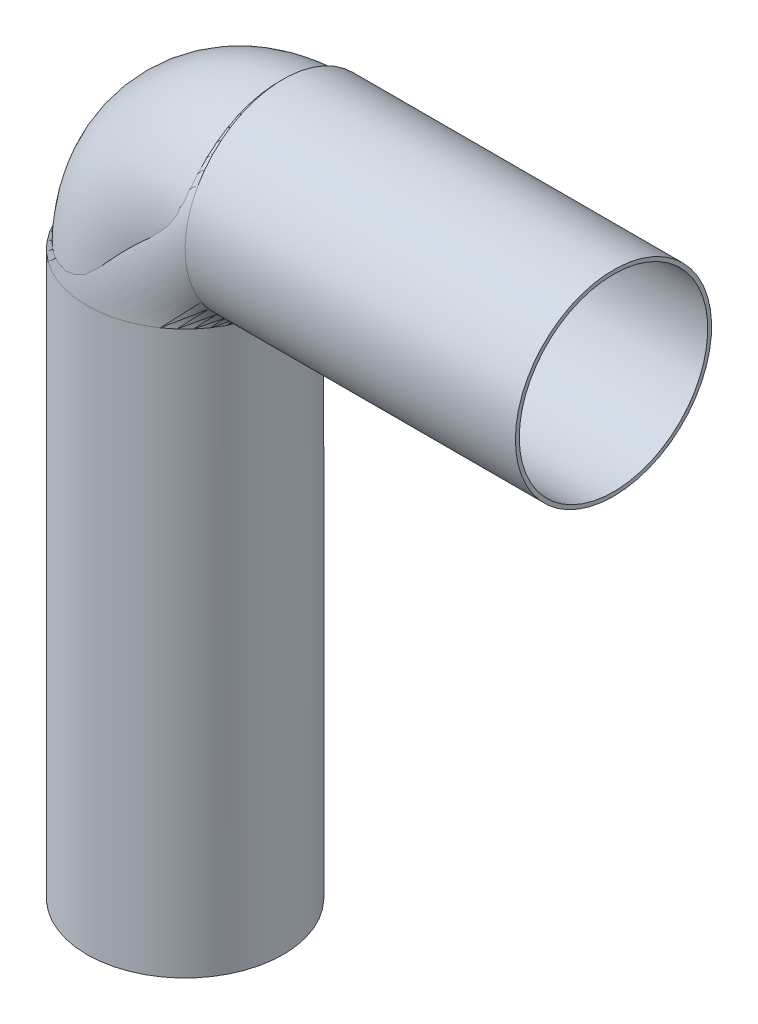
ISO-10303-21;
HEADER;
FILE_DESCRIPTION(('STEP AP214'),'2;1');
FILE_NAME('part.step','',(''),(''),'','','');
FILE_SCHEMA(('AUTOMOTIVE_DESIGN { 1 0 10303 214 1 1 1 1 }'));
ENDSEC;
DATA;
#1=APPLICATION_CONTEXT('core data for automotive mechanical design processes');
#2=APPLICATION_PROTOCOL_DEFINITION('international standard','automotive_design',2000,#1);
#3=PRODUCT_CONTEXT('',#1,'mechanical');
#4=PRODUCT('Part','Part','',(#3));
#5=PRODUCT_RELATED_PRODUCT_CATEGORY('part','',(#4));
#6=PRODUCT_DEFINITION_FORMATION('','',#4);
#7=PRODUCT_DEFINITION_CONTEXT('part definition',#1,'design');
#8=PRODUCT_DEFINITION('design','',#6,#7);
#9=PRODUCT_DEFINITION_SHAPE('','',#8);
#10=(LENGTH_UNIT() NAMED_UNIT(*) SI_UNIT(.MILLI.,.METRE.));
#11=(NAMED_UNIT(*) PLANE_ANGLE_UNIT() SI_UNIT($,.RADIAN.));
#12=(NAMED_UNIT(*) SI_UNIT($,.STERADIAN.) SOLID_ANGLE_UNIT());
#13=UNCERTAINTY_MEASURE_WITH_UNIT(LENGTH_MEASURE(1.E-05),#10,'distance_accuracy_value','');
#14=(GEOMETRIC_REPRESENTATION_CONTEXT(3) GLOBAL_UNCERTAINTY_ASSIGNED_CONTEXT((#13)) GLOBAL_UNIT_ASSIGNED_CONTEXT((#10,
#11,#12)) REPRESENTATION_CONTEXT('',''));
#15=CARTESIAN_POINT('',(0.,0.,0.));
#16=DIRECTION('',(0.,0.,1.));
#17=DIRECTION('',(1.,0.,0.));
#18=AXIS2_PLACEMENT_3D('',#15,#16,#17);
#19=CARTESIAN_POINT('',(0.,0.,0.));
#20=DIRECTION('',(0.,1.,0.));
#21=DIRECTION('',(0.,0.,1.));
#22=AXIS2_PLACEMENT_3D('',#19,#20,#21);
#23=CYLINDRICAL_SURFACE('',#22,11.45);
#24=CARTESIAN_POINT('',(0.,65.59,0.));
#25=DIRECTION('',(0.,1.,0.));
#26=DIRECTION('',(0.,0.,1.));
#27=AXIS2_PLACEMENT_3D('',#24,#25,#26);
#28=CIRCLE('',#27,11.45);
#29=CARTESIAN_POINT('',(11.45,65.59,0.));
#30=VERTEX_POINT('',#29);
#31=EDGE_CURVE('E58',#30,#30,#28,.T.);
#32=ORIENTED_EDGE('',*,*,#31,.F.);
#33=EDGE_LOOP('',(#32));
#34=FACE_BOUND('',#33,.T.);
#35=CARTESIAN_POINT('',(0.,0.,0.));
#36=DIRECTION('',(0.,1.,0.));
#37=DIRECTION('',(0.,0.,1.));
#38=AXIS2_PLACEMENT_3D('',#35,#36,#37);
#39=CIRCLE('',#38,11.45);
#40=CARTESIAN_POINT('',(0.,0.,11.45));
#41=VERTEX_POINT('',#40);
#42=EDGE_CURVE('E63',#41,#41,#39,.T.);
#43=ORIENTED_EDGE('',*,*,#42,.T.);
#44=EDGE_LOOP('',(#43));
#45=FACE_BOUND('',#44,.T.);
#46=ADVANCED_FACE('F45',(#34,#45),#23,.T.);
#47=CARTESIAN_POINT('',(11.45,65.59,0.));
#48=DIRECTION('',(0.,0.,-1.));
#49=DIRECTION('',(-1.,0.,0.));
#50=AXIS2_PLACEMENT_3D('',#47,#48,#49);
#51=DEGENERATE_TOROIDAL_SURFACE('',#50,11.45,11.45,.T.);
#52=CARTESIAN_POINT('',(11.45,77.04,0.));
#53=DIRECTION('',(1.,0.,0.));
#54=DIRECTION('',(0.,0.,1.));
#55=AXIS2_PLACEMENT_3D('',#52,#53,#54);
#56=CIRCLE('',#55,11.45);
#57=EDGE_CURVE('E49',#30,#30,#56,.T.);
#58=ORIENTED_EDGE('',*,*,#57,.F.);
#59=ORIENTED_EDGE('',*,*,#31,.T.);
#60=EDGE_LOOP('',(#58,#59));
#61=FACE_BOUND('',#60,.T.);
#62=ADVANCED_FACE('F88',(#61),#51,.T.);
#63=CARTESIAN_POINT('',(11.45,77.04,0.));
#64=DIRECTION('',(1.,0.,0.));
#65=DIRECTION('',(0.,0.,-1.));
#66=AXIS2_PLACEMENT_3D('',#63,#64,#65);
#67=CYLINDRICAL_SURFACE('',#66,11.45);
#68=CARTESIAN_POINT('',(50.,77.04,0.));
#69=DIRECTION('',(1.,0.,0.));
#70=DIRECTION('',(0.,0.,1.));
#71=AXIS2_PLACEMENT_3D('',#68,#69,#70);
#72=CIRCLE('',#71,11.45);
#73=CARTESIAN_POINT('',(50.,77.04,11.45));
#74=VERTEX_POINT('',#73);
#75=EDGE_CURVE('E67',#74,#74,#72,.T.);
#76=ORIENTED_EDGE('',*,*,#75,.F.);
#77=EDGE_LOOP('',(#76));
#78=FACE_BOUND('',#77,.T.);
#79=ORIENTED_EDGE('',*,*,#57,.T.);
#80=EDGE_LOOP('',(#79));
#81=FACE_BOUND('',#80,.T.);
#82=ADVANCED_FACE('F47',(#78,#81),#67,.T.);
#83=CARTESIAN_POINT('',(0.,0.,0.));
#84=DIRECTION('',(0.,1.,0.));
#85=DIRECTION('',(0.,0.,1.));
#86=AXIS2_PLACEMENT_3D('',#83,#84,#85);
#87=PLANE('',#86);
#88=CARTESIAN_POINT('',(0.,0.,0.));
#89=DIRECTION('',(0.,1.,0.));
#90=DIRECTION('',(0.,0.,1.));
#91=AXIS2_PLACEMENT_3D('',#88,#89,#90);
#92=CIRCLE('',#91,11.);
#93=CARTESIAN_POINT('',(0.,0.,11.));
#94=VERTEX_POINT('',#93);
#95=EDGE_CURVE('E69',#94,#94,#92,.F.);
#96=ORIENTED_EDGE('',*,*,#95,.F.);
#97=EDGE_LOOP('',(#96));
#98=FACE_BOUND('',#97,.T.);
#99=ORIENTED_EDGE('',*,*,#42,.F.);
#100=EDGE_LOOP('',(#99));
#101=FACE_BOUND('',#100,.T.);
#102=ADVANCED_FACE('F81',(#98,#101),#87,.F.);
#103=CARTESIAN_POINT('',(50.,77.04,0.));
#104=DIRECTION('',(1.,0.,0.));
#105=DIRECTION('',(0.,0.,1.));
#106=AXIS2_PLACEMENT_3D('',#103,#104,#105);
#107=PLANE('',#106);
#108=CARTESIAN_POINT('',(50.,77.04,0.));
#109=DIRECTION('',(1.,0.,0.));
#110=DIRECTION('',(0.,0.,1.));
#111=AXIS2_PLACEMENT_3D('',#108,#109,#110);
#112=CIRCLE('',#111,11.);
#113=CARTESIAN_POINT('',(50.,77.04,11.));
#114=VERTEX_POINT('',#113);
#115=EDGE_CURVE('E11',#114,#114,#112,.F.);
#116=ORIENTED_EDGE('',*,*,#115,.T.);
#117=EDGE_LOOP('',(#116));
#118=FACE_BOUND('',#117,.T.);
#119=ORIENTED_EDGE('',*,*,#75,.T.);
#120=EDGE_LOOP('',(#119));
#121=FACE_BOUND('',#120,.T.);
#122=ADVANCED_FACE('F84',(#118,#121),#107,.T.);
#123=CARTESIAN_POINT('',(0.,0.,0.));
#124=DIRECTION('',(0.,1.,0.));
#125=DIRECTION('',(0.,0.,1.));
#126=AXIS2_PLACEMENT_3D('',#123,#124,#125);
#127=CYLINDRICAL_SURFACE('',#126,11.);
#128=CARTESIAN_POINT('',(0.,65.59,0.));
#129=DIRECTION('',(0.,1.,0.));
#130=DIRECTION('',(0.,0.,1.));
#131=AXIS2_PLACEMENT_3D('',#128,#129,#130);
#132=CIRCLE('',#131,11.);
#133=CARTESIAN_POINT('',(-11.,65.59,0.));
#134=VERTEX_POINT('',#133);
#135=EDGE_CURVE('E73',#134,#134,#132,.F.);
#136=ORIENTED_EDGE('',*,*,#135,.F.);
#137=EDGE_LOOP('',(#136));
#138=FACE_BOUND('',#137,.T.);
#139=ORIENTED_EDGE('',*,*,#95,.T.);
#140=EDGE_LOOP('',(#139));
#141=FACE_BOUND('',#140,.T.);
#142=ADVANCED_FACE('F79',(#138,#141),#127,.F.);
#143=CARTESIAN_POINT('',(11.45,65.59,0.));
#144=DIRECTION('',(0.,0.,-1.));
#145=DIRECTION('',(-1.,0.,0.));
#146=AXIS2_PLACEMENT_3D('',#143,#144,#145);
#147=TOROIDAL_SURFACE('',#146,11.45,11.);
#148=CARTESIAN_POINT('',(11.45,77.04,0.));
#149=DIRECTION('',(1.,0.,0.));
#150=DIRECTION('',(0.,0.,1.));
#151=AXIS2_PLACEMENT_3D('',#148,#149,#150);
#152=CIRCLE('',#151,11.);
#153=CARTESIAN_POINT('',(11.45,88.04,0.));
#154=VERTEX_POINT('',#153);
#155=EDGE_CURVE('E53',#154,#154,#152,.F.);
#156=CARTESIAN_POINT('',(11.45,65.59,0.));
#157=DIRECTION('',(0.,0.,-1.));
#158=DIRECTION('',(-1.,0.,0.));
#159=AXIS2_PLACEMENT_3D('',#156,#157,#158);
#160=CIRCLE('',#159,22.45);
#161=EDGE_CURVE('',#134,#154,#160,.T.);
#162=ORIENTED_EDGE('',*,*,#135,.T.);
#163=ORIENTED_EDGE('',*,*,#155,.F.);
#164=ORIENTED_EDGE('',*,*,#161,.T.);
#165=ORIENTED_EDGE('',*,*,#161,.F.);
#166=EDGE_LOOP('',(#162,#164,#163,#165));
#167=FACE_BOUND('',#166,.T.);
#168=ADVANCED_FACE('F95',(#167),#147,.F.);
#169=CARTESIAN_POINT('',(11.45,77.04,0.));
#170=DIRECTION('',(1.,0.,0.));
#171=DIRECTION('',(0.,0.,-1.));
#172=AXIS2_PLACEMENT_3D('',#169,#170,#171);
#173=CYLINDRICAL_SURFACE('',#172,11.);
#174=ORIENTED_EDGE('',*,*,#115,.F.);
#175=EDGE_LOOP('',(#174));
#176=FACE_BOUND('',#175,.T.);
#177=ORIENTED_EDGE('',*,*,#155,.T.);
#178=EDGE_LOOP('',(#177));
#179=FACE_BOUND('',#178,.T.);
#180=ADVANCED_FACE('F93',(#176,#179),#173,.F.);
#181=CLOSED_SHELL('',(#46,#62,#82,#102,#122,#142,#168,#180));
#182=MANIFOLD_SOLID_BREP('B2',#181);
#183=ADVANCED_BREP_SHAPE_REPRESENTATION('',(#18,#182),#14);
#184=SHAPE_DEFINITION_REPRESENTATION(#9,#183);
ENDSEC;
END-ISO-10303-21;
